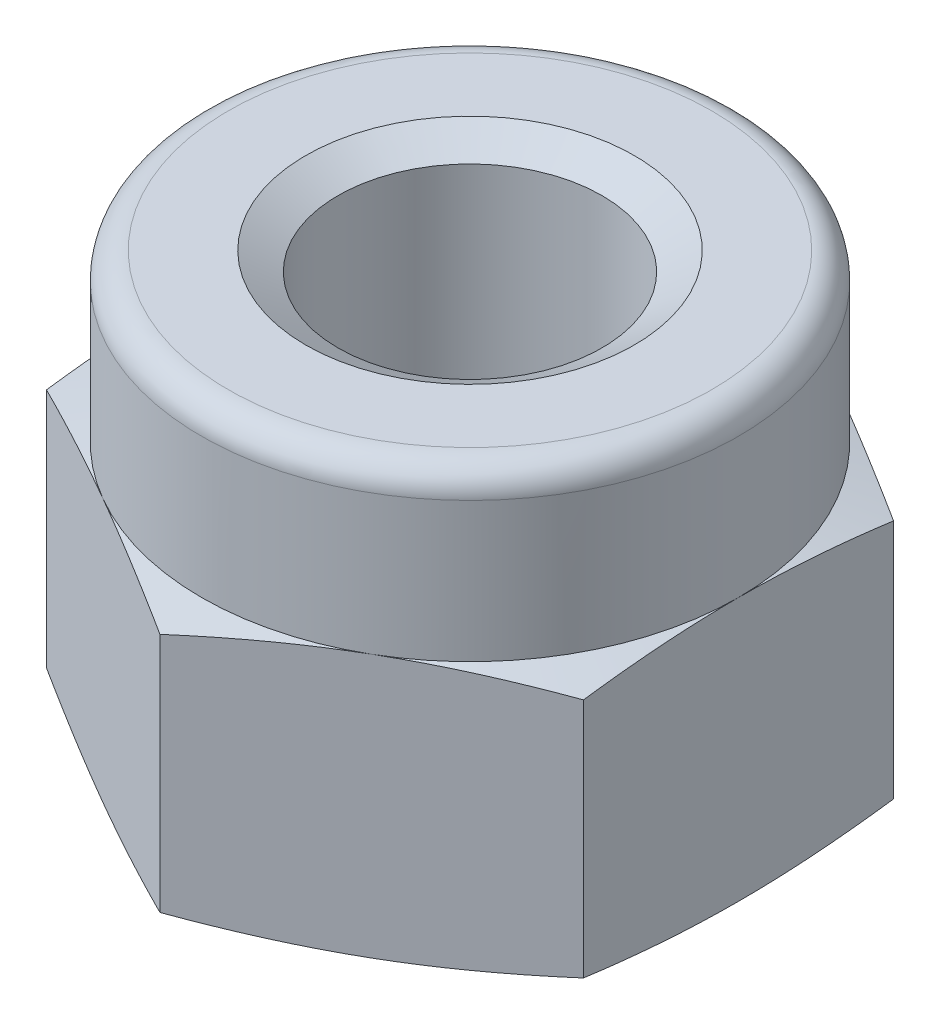
ISO-10303-21;
HEADER;
FILE_DESCRIPTION(('STEP AP214'),'2;1');
FILE_NAME('part.step','',(''),(''),'','','');
FILE_SCHEMA(('AUTOMOTIVE_DESIGN { 1 0 10303 214 1 1 1 1 }'));
ENDSEC;
DATA;
#1=APPLICATION_CONTEXT('core data for automotive mechanical design processes');
#2=APPLICATION_PROTOCOL_DEFINITION('international standard','automotive_design',2000,#1);
#3=PRODUCT_CONTEXT('',#1,'mechanical');
#4=PRODUCT('Part','Part','',(#3));
#5=PRODUCT_RELATED_PRODUCT_CATEGORY('part','',(#4));
#6=PRODUCT_DEFINITION_FORMATION('','',#4);
#7=PRODUCT_DEFINITION_CONTEXT('part definition',#1,'design');
#8=PRODUCT_DEFINITION('design','',#6,#7);
#9=PRODUCT_DEFINITION_SHAPE('','',#8);
#10=(LENGTH_UNIT() NAMED_UNIT(*) SI_UNIT(.MILLI.,.METRE.));
#11=(NAMED_UNIT(*) PLANE_ANGLE_UNIT() SI_UNIT($,.RADIAN.));
#12=(NAMED_UNIT(*) SI_UNIT($,.STERADIAN.) SOLID_ANGLE_UNIT());
#13=UNCERTAINTY_MEASURE_WITH_UNIT(LENGTH_MEASURE(1.E-05),#10,'distance_accuracy_value','');
#14=(GEOMETRIC_REPRESENTATION_CONTEXT(3) GLOBAL_UNCERTAINTY_ASSIGNED_CONTEXT((#13)) GLOBAL_UNIT_ASSIGNED_CONTEXT((#10,
#11,#12)) REPRESENTATION_CONTEXT('',''));
#15=CARTESIAN_POINT('',(0.,0.,0.));
#16=DIRECTION('',(0.,0.,1.));
#17=DIRECTION('',(1.,0.,0.));
#18=AXIS2_PLACEMENT_3D('',#15,#16,#17);
#19=CARTESIAN_POINT('',(5.00000000000105,-2.45,-2.88675134594868));
#20=DIRECTION('',(-1.,0.,-3.6340990143452E-13));
#21=DIRECTION('',(-3.6340990143452E-13,0.,1.));
#22=AXIS2_PLACEMENT_3D('',#19,#20,#21);
#23=PLANE('',#22);
#24=CARTESIAN_POINT('',(4.99999999999685,1.10934459288645,8.66417297932728));
#25=CARTESIAN_POINT('',(4.99999999999693,1.15808614967386,8.45412169108949));
#26=CARTESIAN_POINT('',(4.99999999999701,1.20641968231584,8.2439749367323));
#27=CARTESIAN_POINT('',(4.99999999999716,1.30208749492634,7.82345057278734));
#28=CARTESIAN_POINT('',(4.99999999999724,1.34942175824772,7.61307295941494));
#29=CARTESIAN_POINT('',(4.99999999999739,1.44291588680185,7.19201028723198));
#30=CARTESIAN_POINT('',(4.99999999999747,1.48907550643841,6.98132517370842));
#31=CARTESIAN_POINT('',(4.99999999999762,1.57996348211581,6.55964793700647));
#32=CARTESIAN_POINT('',(4.99999999999769,1.62469184297197,6.34865581486346));
#33=CARTESIAN_POINT('',(4.99999999999793,1.75712266829011,5.71122740580277));
#34=CARTESIAN_POINT('',(4.99999999999808,1.84219487473616,5.28423568193629));
#35=CARTESIAN_POINT('',(4.99999999999839,2.00199924023723,4.42825912558533));
#36=CARTESIAN_POINT('',(4.99999999999855,2.0767305268644,3.99927412808701));
#37=CARTESIAN_POINT('',(4.99999999999886,2.2088694770559,3.15035991830124));
#38=CARTESIAN_POINT('',(4.99999999999901,2.26668904574731,2.73049749789896));
#39=CARTESIAN_POINT('',(4.99999999999924,2.33763793791692,2.09896734425149));
#40=CARTESIAN_POINT('',(4.99999999999932,2.35865631824952,1.88818678859669));
#41=CARTESIAN_POINT('',(4.99999999999947,2.39462146723631,1.46611392864948));
#42=CARTESIAN_POINT('',(4.99999999999954,2.40956865320926,1.25482166053561));
#43=CARTESIAN_POINT('',(4.9999999999997,2.43266726095044,0.832771506173624));
#44=CARTESIAN_POINT('',(4.99999999999978,2.44084761509829,0.622015226370882));
#45=CARTESIAN_POINT('',(4.99999999999993,2.4501072703111,0.200344833296584));
#46=CARTESIAN_POINT('',(5.00000000000001,2.45118659959506,-0.0105692793444221));
#47=CARTESIAN_POINT('',(5.00000000000016,2.44618667142744,-0.432327799392837));
#48=CARTESIAN_POINT('',(5.00000000000024,2.4401068634497,-0.643172200192301));
#49=CARTESIAN_POINT('',(5.00000000000039,2.42110292737698,-1.06454502542287));
#50=CARTESIAN_POINT('',(5.00000000000046,2.40817881293568,-1.27507345048348));
#51=CARTESIAN_POINT('',(5.00000000000065,2.3692469157974,-1.78526753626905));
#52=CARTESIAN_POINT('',(5.00000000000076,2.34001060854997,-2.0846867910644));
#53=CARTESIAN_POINT('',(5.00000000000098,2.27111774430938,-2.68227635693411));
#54=CARTESIAN_POINT('',(5.00000000000108,2.23146161252042,-2.98044671846803));
#55=CARTESIAN_POINT('',(5.0000000000013,2.14389497710899,-3.57650881311258));
#56=CARTESIAN_POINT('',(5.00000000000141,2.0959590232753,-3.8743967522919));
#57=CARTESIAN_POINT('',(5.00000000000162,1.99387348312166,-4.4690916535893));
#58=CARTESIAN_POINT('',(5.00000000000173,1.93972392757731,-4.76589862105388));
#59=CARTESIAN_POINT('',(5.00000000000195,1.8255759229453,-5.36466752407298));
#60=CARTESIAN_POINT('',(5.00000000000206,1.76548055597248,-5.66661084262669));
#61=CARTESIAN_POINT('',(5.00000000000228,1.64159901952771,-6.26973849767605));
#62=CARTESIAN_POINT('',(5.00000000000239,1.57781280993869,-6.57092282588481));
#63=CARTESIAN_POINT('',(5.00000000000261,1.44778554471525,-7.17106884648911));
#64=CARTESIAN_POINT('',(5.00000000000272,1.38155947444426,-7.47003380096172));
#65=CARTESIAN_POINT('',(5.00000000000293,1.24693398621573,-8.06745283586174));
#66=CARTESIAN_POINT('',(5.00000000000304,1.1785347200478,-8.36590695044156));
#67=CARTESIAN_POINT('',(5.00000000000315,1.10934459288535,-8.66417297932839));
#68=B_SPLINE_CURVE_WITH_KNOTS('',3,(#24,#25,#26,#27,#28,#29,#30,#31,#32,#33,#34,#35,#36,#37,#38,
#39,#40,#41,#42,#43,#44,#45,#46,#47,#48,#49,#50,#51,#52,#53,#54,#55,#56,#57,#58,#59,#60,#61,#62,
#63,#64,#65,#66,#67),.UNSPECIFIED.,.F.,.F.,(4,2,2,2,2,2,2,2,2,2,2,2,2,2,2,2,2,2,2,2,2,4),(0.,
0.646897511041875,1.29380579046934,1.94084823323586,2.58788849886854,3.89394954484933,
5.20012071161692,6.47115823307902,7.10656342538024,7.74192493411692,8.37455563035548,
9.00718381255952,9.63986064603122,10.2725362173825,11.1748227850967,12.0770725387094,
12.9821466196792,13.887216218064,14.810782909334,15.7343596410585,16.6529875210141,
17.5715513786974),.UNSPECIFIED.);
#69=CARTESIAN_POINT('',(4.99999999999895,2.24274057836342,2.88675134594756));
#70=VERTEX_POINT('',#69);
#71=CARTESIAN_POINT('',(5.,2.45,0.));
#72=VERTEX_POINT('',#71);
#73=EDGE_CURVE('E174',#70,#72,#68,.T.);
#74=ORIENTED_EDGE('',*,*,#73,.F.);
#75=DIRECTION('',(0.,1.,0.));
#76=VECTOR('',#75,1.);
#77=CARTESIAN_POINT('',(4.99999999999895,-2.45,2.88675134594756));
#78=LINE('',#77,#76);
#79=CARTESIAN_POINT('',(5.00000000000305,-2.24274057836278,2.8867513459452));
#80=VERTEX_POINT('',#79);
#81=EDGE_CURVE('E345',#80,#70,#78,.T.);
#82=ORIENTED_EDGE('',*,*,#81,.F.);
#83=CARTESIAN_POINT('',(5.00000000000315,-1.10934459288535,-8.66417297932839));
#84=CARTESIAN_POINT('',(5.00000000000307,-1.15808614967279,-8.45412169109052));
#85=CARTESIAN_POINT('',(5.000000000003,-1.20641968231479,-8.24397493673324));
#86=CARTESIAN_POINT('',(5.00000000000284,-1.30208749492535,-7.82345057278811));
#87=CARTESIAN_POINT('',(5.00000000000277,-1.34942175824675,-7.61307295941563));
#88=CARTESIAN_POINT('',(5.00000000000261,-1.44291588680093,-7.1920102872325));
#89=CARTESIAN_POINT('',(5.00000000000254,-1.48907550643752,-6.98132517370886));
#90=CARTESIAN_POINT('',(5.00000000000239,-1.57996348211498,-6.55964793700674));
#91=CARTESIAN_POINT('',(5.00000000000231,-1.62469184297117,-6.34865581486365));
#92=CARTESIAN_POINT('',(5.00000000000208,-1.75712266828939,-5.71122740580269));
#93=CARTESIAN_POINT('',(5.00000000000192,-1.8421948747355,-5.28423568193604));
#94=CARTESIAN_POINT('',(5.00000000000161,-2.00199924023669,-4.42825912558472));
#95=CARTESIAN_POINT('',(5.00000000000145,-2.07673052686392,-3.99927412808623));
#96=CARTESIAN_POINT('',(5.00000000000115,-2.20886947705554,-3.15035991830012));
#97=CARTESIAN_POINT('',(5.00000000000099,-2.26668904574701,-2.73049749789768));
#98=CARTESIAN_POINT('',(5.00000000000076,-2.3376379379167,-2.09896734424996));
#99=CARTESIAN_POINT('',(5.00000000000069,-2.35865631824933,-1.88818678859507));
#100=CARTESIAN_POINT('',(5.00000000000053,-2.39462146723617,-1.4661139286477));
#101=CARTESIAN_POINT('',(5.00000000000046,-2.40956865320915,-1.25482166053375));
#102=CARTESIAN_POINT('',(5.0000000000003,-2.43266726095037,-0.832771506171595));
#103=CARTESIAN_POINT('',(5.00000000000023,-2.44084761509824,-0.62201522636877));
#104=CARTESIAN_POINT('',(5.00000000000007,-2.45010727031109,-0.200344833294306));
#105=CARTESIAN_POINT('',(5.,-2.45118659959506,0.0105692793467844));
#106=CARTESIAN_POINT('',(4.99999999999984,-2.44618667142746,0.432327799395367));
#107=CARTESIAN_POINT('',(4.99999999999977,-2.44010686344974,0.643172200194915));
#108=CARTESIAN_POINT('',(4.99999999999961,-2.42110292737703,1.06454502542566));
#109=CARTESIAN_POINT('',(4.99999999999954,-2.40817881293573,1.27507345048635));
#110=CARTESIAN_POINT('',(4.99999999999935,-2.36924691579747,1.78526753627182));
#111=CARTESIAN_POINT('',(4.99999999999924,-2.34001060855007,2.08468679106701));
#112=CARTESIAN_POINT('',(4.99999999999903,-2.27111774430955,2.68227635693638));
#113=CARTESIAN_POINT('',(4.99999999999892,-2.23146161252063,2.98044671847014));
#114=CARTESIAN_POINT('',(4.9999999999987,-2.14389497710927,3.57650881311436));
#115=CARTESIAN_POINT('',(4.99999999999859,-2.09595902327563,3.8743967522935));
#116=CARTESIAN_POINT('',(4.99999999999838,-1.99387348312208,4.46909165359058));
#117=CARTESIAN_POINT('',(4.99999999999827,-1.93972392757777,4.76589862105498));
#118=CARTESIAN_POINT('',(4.99999999999805,-1.82557592294586,5.36466752407375));
#119=CARTESIAN_POINT('',(4.99999999999794,-1.76548055597309,5.66661084262729));
#120=CARTESIAN_POINT('',(4.99999999999772,-1.64159901952842,6.2697384976763));
#121=CARTESIAN_POINT('',(4.99999999999761,-1.57781280993945,6.5709228258849));
#122=CARTESIAN_POINT('',(4.9999999999974,-1.4477855447161,7.17106884648885));
#123=CARTESIAN_POINT('',(4.99999999999729,-1.38155947444516,7.47003380096129));
#124=CARTESIAN_POINT('',(4.99999999999707,-1.24693398621674,8.06745283586097));
#125=CARTESIAN_POINT('',(4.99999999999696,-1.17853472004885,8.36590695044062));
#126=CARTESIAN_POINT('',(4.99999999999685,-1.10934459288645,8.66417297932728));
#127=B_SPLINE_CURVE_WITH_KNOTS('',3,(#83,#84,#85,#86,#87,#88,#89,#90,#91,#92,#93,#94,#95,#96,
#97,#98,#99,#100,#101,#102,#103,#104,#105,#106,#107,#108,#109,#110,#111,#112,#113,#114,#115,
#116,#117,#118,#119,#120,#121,#122,#123,#124,#125,#126),.UNSPECIFIED.,.F.,.F.,(4,2,2,2,2,2,2,2,
2,2,2,2,2,2,2,2,2,2,2,2,2,4),(0.,0.64689751104214,1.29380579046987,1.94084823323665,
2.5878884988696,3.89394954485094,5.20012071161908,6.47115823308169,7.10656342538316,
7.7419249341201,8.37455563035891,9.0071838125632,9.63986064603515,10.2725362173867,
11.1748227851003,12.0770725387126,12.9821466196819,13.8872162180661,14.8107829093356,
15.7343596410595,16.6529875210146,17.5715513786974),.UNSPECIFIED.);
#128=CARTESIAN_POINT('',(5.,-2.45,1.81590693388966E-12));
#129=VERTEX_POINT('',#128);
#130=EDGE_CURVE('E918',#129,#80,#127,.T.);
#131=ORIENTED_EDGE('',*,*,#130,.F.);
#132=CARTESIAN_POINT('',(5.00000000000105,-2.24274057836278,-2.88675134594868));
#133=VERTEX_POINT('',#132);
#134=EDGE_CURVE('E919',#133,#129,#127,.T.);
#135=ORIENTED_EDGE('',*,*,#134,.F.);
#136=DIRECTION('',(0.,1.,0.));
#137=VECTOR('',#136,1.);
#138=CARTESIAN_POINT('',(5.00000000000105,-2.45,-2.88675134594868));
#139=LINE('',#138,#137);
#140=CARTESIAN_POINT('',(5.00000000000103,2.24274057836278,-2.88675134594869));
#141=VERTEX_POINT('',#140);
#142=EDGE_CURVE('E921',#133,#141,#139,.T.);
#143=ORIENTED_EDGE('',*,*,#142,.T.);
#144=EDGE_CURVE('E139',#72,#141,#68,.T.);
#145=ORIENTED_EDGE('',*,*,#144,.F.);
#146=EDGE_LOOP('',(#74,#82,#131,#135,#143,#145));
#147=FACE_BOUND('',#146,.T.);
#148=ADVANCED_FACE('F18',(#147),#23,.F.);
#149=CARTESIAN_POINT('',(4.99999999999895,-2.45,2.88675134594756));
#150=DIRECTION('',(-0.500000000000305,0.,-0.866025403784263));
#151=DIRECTION('',(-0.866025403784263,0.,0.500000000000305));
#152=AXIS2_PLACEMENT_3D('',#149,#150,#151);
#153=PLANE('',#152);
#154=CARTESIAN_POINT('',(-0.000200000000000168,2.24270963732693,5.77361816195127));
#155=CARTESIAN_POINT('',(0.207454004305619,2.2748479038167,5.65372906666702));
#156=CARTESIAN_POINT('',(0.415484518325616,2.30402418697629,5.53362259339782));
#157=CARTESIAN_POINT('',(0.832280248969635,2.35528422981972,5.29298546611322));
#158=CARTESIAN_POINT('',(1.04104572932951,2.37736510843063,5.17245465982984));
#159=CARTESIAN_POINT('',(1.45804559853937,2.41314523215366,4.9316996730893));
#160=CARTESIAN_POINT('',(1.66627716741271,2.42688714813309,4.8114771207464));
#161=CARTESIAN_POINT('',(2.08300586365663,2.44531365579599,4.57087869579073));
#162=CARTESIAN_POINT('',(2.29150293182804,2.44999999999997,4.45050285735662));
#163=CARTESIAN_POINT('',(2.70849706817087,2.45000000000003,4.2097511804884));
#164=CARTESIAN_POINT('',(2.91699413634228,2.44531365579611,4.08937534205429));
#165=CARTESIAN_POINT('',(3.3337228325862,2.42688714813334,3.84877691709862));
#166=CARTESIAN_POINT('',(3.54195440145955,2.41314523215396,3.72855436475572));
#167=CARTESIAN_POINT('',(3.95895427066942,2.37736510843104,3.48779937801517));
#168=CARTESIAN_POINT('',(4.1677197510293,2.35528422982018,3.36726857173179));
#169=CARTESIAN_POINT('',(4.58451548167332,2.30402418697684,3.12663144444718));
#170=CARTESIAN_POINT('',(4.79254599569333,2.27484790381729,3.00652497117798));
#171=CARTESIAN_POINT('',(5.00019999999895,2.24270963732755,2.88663587589373));
#172=B_SPLINE_CURVE_WITH_KNOTS('',3,(#154,#155,#156,#157,#158,#159,#160,#161,#162,#163,#164,
#165,#166,#167,#168,#169,#170,#171),.UNSPECIFIED.,.F.,.F.,(4,2,2,2,2,2,2,2,4),(0.,
0.725805237679802,1.4519048156153,2.1742568688339,2.89646911159514,3.61868135435637,
4.34103340757497,5.06713298551048,5.79293822319028),.UNSPECIFIED.);
#173=CARTESIAN_POINT('',(0.,2.24274057836278,5.77350269189743));
#174=VERTEX_POINT('',#173);
#175=CARTESIAN_POINT('',(2.50000000000153,2.45,4.33012701892132));
#176=VERTEX_POINT('',#175);
#177=EDGE_CURVE('E238',#174,#176,#172,.T.);
#178=ORIENTED_EDGE('',*,*,#177,.F.);
#179=DIRECTION('',(0.,1.,0.));
#180=VECTOR('',#179,1.);
#181=CARTESIAN_POINT('',(0.,-2.45,5.77350269189743));
#182=LINE('',#181,#180);
#183=CARTESIAN_POINT('',(0.,-2.24274057836278,5.77350269189743));
#184=VERTEX_POINT('',#183);
#185=EDGE_CURVE('E341',#184,#174,#182,.T.);
#186=ORIENTED_EDGE('',*,*,#185,.F.);
#187=CARTESIAN_POINT('',(5.00019999999895,-2.24270963732755,2.88663587589373));
#188=CARTESIAN_POINT('',(4.79254599569333,-2.27484790381729,3.00652497117798));
#189=CARTESIAN_POINT('',(4.58451548167332,-2.30402418697684,3.12663144444718));
#190=CARTESIAN_POINT('',(4.1677197510293,-2.35528422982018,3.36726857173179));
#191=CARTESIAN_POINT('',(3.95895427066942,-2.37736510843104,3.48779937801517));
#192=CARTESIAN_POINT('',(3.54195440145955,-2.41314523215395,3.72855436475572));
#193=CARTESIAN_POINT('',(3.3337228325862,-2.42688714813333,3.84877691709862));
#194=CARTESIAN_POINT('',(2.91699413634228,-2.44531365579611,4.08937534205429));
#195=CARTESIAN_POINT('',(2.70849706817087,-2.45000000000003,4.2097511804884));
#196=CARTESIAN_POINT('',(2.29150293182804,-2.44999999999997,4.45050285735662));
#197=CARTESIAN_POINT('',(2.08300586365663,-2.44531365579599,4.57087869579073));
#198=CARTESIAN_POINT('',(1.66627716741271,-2.42688714813309,4.8114771207464));
#199=CARTESIAN_POINT('',(1.45804559853937,-2.41314523215365,4.9316996730893));
#200=CARTESIAN_POINT('',(1.04104572932951,-2.37736510843063,5.17245465982984));
#201=CARTESIAN_POINT('',(0.832280248969634,-2.35528422981972,5.29298546611322));
#202=CARTESIAN_POINT('',(0.415484518325616,-2.30402418697629,5.53362259339782));
#203=CARTESIAN_POINT('',(0.207454004305619,-2.2748479038167,5.65372906666702));
#204=CARTESIAN_POINT('',(-0.00020000000000088,-2.24270963732693,5.77361816195127));
#205=B_SPLINE_CURVE_WITH_KNOTS('',3,(#187,#188,#189,#190,#191,#192,#193,#194,#195,#196,#197,
#198,#199,#200,#201,#202,#203,#204),.UNSPECIFIED.,.F.,.F.,(4,2,2,2,2,2,2,2,4),(0.,
0.725805237679804,1.45190481561531,2.17425686883391,2.89646911159515,3.61868135435638,
4.34103340757498,5.06713298551048,5.79293822319028),.UNSPECIFIED.);
#206=CARTESIAN_POINT('',(2.50000000000153,-2.45,4.33012701892132));
#207=VERTEX_POINT('',#206);
#208=EDGE_CURVE('E373',#207,#184,#205,.T.);
#209=ORIENTED_EDGE('',*,*,#208,.F.);
#210=EDGE_CURVE('E917',#80,#207,#205,.T.);
#211=ORIENTED_EDGE('',*,*,#210,.F.);
#212=ORIENTED_EDGE('',*,*,#81,.T.);
#213=EDGE_CURVE('E43',#176,#70,#172,.T.);
#214=ORIENTED_EDGE('',*,*,#213,.F.);
#215=EDGE_LOOP('',(#178,#186,#209,#211,#212,#214));
#216=FACE_BOUND('',#215,.T.);
#217=ADVANCED_FACE('F297',(#216),#153,.F.);
#218=CARTESIAN_POINT('',(0.,-2.45,5.77350269189743));
#219=DIRECTION('',(0.500000000000309,0.,-0.86602540378426));
#220=DIRECTION('',(-0.86602540378426,0.,-0.500000000000309));
#221=AXIS2_PLACEMENT_3D('',#218,#219,#220);
#222=PLANE('',#221);
#223=CARTESIAN_POINT('',(-5.000199999999,2.24270963732755,2.88663587589366));
#224=CARTESIAN_POINT('',(-4.79254599569337,2.27484790381729,3.00652497117792));
#225=CARTESIAN_POINT('',(-4.58451548167337,2.30402418697684,3.12663144444712));
#226=CARTESIAN_POINT('',(-4.16771975102934,2.35528422982018,3.36726857173174));
#227=CARTESIAN_POINT('',(-3.95895427066946,2.37736510843104,3.48779937801512));
#228=CARTESIAN_POINT('',(-3.54195440145958,2.41314523215396,3.72855436475567));
#229=CARTESIAN_POINT('',(-3.33372283258623,2.42688714813334,3.84877691709858));
#230=CARTESIAN_POINT('',(-2.91699413634231,2.44531365579612,4.08937534205425));
#231=CARTESIAN_POINT('',(-2.70849706817089,2.45000000000004,4.20975118048836));
#232=CARTESIAN_POINT('',(-2.29150293182806,2.44999999999997,4.45050285735659));
#233=CARTESIAN_POINT('',(-2.08300586365665,2.445313655796,4.5708786957907));
#234=CARTESIAN_POINT('',(-1.66627716741273,2.4268871481331,4.81147712074637));
#235=CARTESIAN_POINT('',(-1.45804559853938,2.41314523215366,4.93169967308928));
#236=CARTESIAN_POINT('',(-1.04104572932952,2.37736510843064,5.17245465982983));
#237=CARTESIAN_POINT('',(-0.832280248969641,2.35528422981972,5.2929854661132));
#238=CARTESIAN_POINT('',(-0.41548451832562,2.30402418697629,5.53362259339781));
#239=CARTESIAN_POINT('',(-0.207454004305621,2.2748479038167,5.65372906666702));
#240=CARTESIAN_POINT('',(0.000199999999998921,2.24270963732693,5.77361816195127));
#241=B_SPLINE_CURVE_WITH_KNOTS('',3,(#223,#224,#225,#226,#227,#228,#229,#230,#231,#232,#233,
#234,#235,#236,#237,#238,#239,#240),.UNSPECIFIED.,.F.,.F.,(4,2,2,2,2,2,2,2,4),(0.,
0.725805237679813,1.45190481561533,2.17425686883394,2.89646911159518,3.61868135435643,
4.34103340757503,5.06713298551055,5.79293822319036),.UNSPECIFIED.);
#242=CARTESIAN_POINT('',(-4.999999999999,2.24274057836278,2.88675134595221));
#243=VERTEX_POINT('',#242);
#244=CARTESIAN_POINT('',(-2.50000000000155,2.45,4.3301270189213));
#245=VERTEX_POINT('',#244);
#246=EDGE_CURVE('E250',#243,#245,#241,.T.);
#247=ORIENTED_EDGE('',*,*,#246,.F.);
#248=DIRECTION('',(0.,1.,0.));
#249=VECTOR('',#248,1.);
#250=CARTESIAN_POINT('',(-4.999999999999,-2.45,2.8867513459475));
#251=LINE('',#250,#249);
#252=CARTESIAN_POINT('',(-4.999999999999,-2.24274057836278,2.88675134595221));
#253=VERTEX_POINT('',#252);
#254=EDGE_CURVE('E335',#253,#243,#251,.T.);
#255=ORIENTED_EDGE('',*,*,#254,.F.);
#256=CARTESIAN_POINT('',(0.0002,-2.24270963732693,5.77361816195127));
#257=CARTESIAN_POINT('',(-0.20745400430562,-2.2748479038167,5.65372906666702));
#258=CARTESIAN_POINT('',(-0.415484518325619,-2.30402418697629,5.53362259339781));
#259=CARTESIAN_POINT('',(-0.832280248969641,-2.35528422981972,5.2929854661132));
#260=CARTESIAN_POINT('',(-1.04104572932952,-2.37736510843064,5.17245465982983));
#261=CARTESIAN_POINT('',(-1.45804559853938,-2.41314523215366,4.93169967308928));
#262=CARTESIAN_POINT('',(-1.66627716741273,-2.4268871481331,4.81147712074637));
#263=CARTESIAN_POINT('',(-2.08300586365665,-2.44531365579599,4.5708786957907));
#264=CARTESIAN_POINT('',(-2.29150293182806,-2.44999999999997,4.45050285735659));
#265=CARTESIAN_POINT('',(-2.70849706817089,-2.45000000000003,4.20975118048836));
#266=CARTESIAN_POINT('',(-2.91699413634231,-2.44531365579612,4.08937534205425));
#267=CARTESIAN_POINT('',(-3.33372283258623,-2.42688714813334,3.84877691709858));
#268=CARTESIAN_POINT('',(-3.54195440145958,-2.41314523215396,3.72855436475567));
#269=CARTESIAN_POINT('',(-3.95895427066946,-2.37736510843104,3.48779937801512));
#270=CARTESIAN_POINT('',(-4.16771975102934,-2.35528422982018,3.36726857173174));
#271=CARTESIAN_POINT('',(-4.58451548167337,-2.30402418697684,3.12663144444712));
#272=CARTESIAN_POINT('',(-4.79254599569337,-2.27484790381729,3.00652497117792));
#273=CARTESIAN_POINT('',(-5.000199999999,-2.24270963732755,2.88663587589366));
#274=B_SPLINE_CURVE_WITH_KNOTS('',3,(#256,#257,#258,#259,#260,#261,#262,#263,#264,#265,#266,
#267,#268,#269,#270,#271,#272,#273),.UNSPECIFIED.,.F.,.F.,(4,2,2,2,2,2,2,2,4),(0.,
0.725805237679811,1.45190481561532,2.17425686883393,2.89646911159517,3.61868135435642,
4.34103340757503,5.06713298551054,5.79293822319036),.UNSPECIFIED.);
#275=CARTESIAN_POINT('',(-2.50000000000155,-2.45,4.3301270189213));
#276=VERTEX_POINT('',#275);
#277=EDGE_CURVE('E368',#276,#253,#274,.T.);
#278=ORIENTED_EDGE('',*,*,#277,.F.);
#279=EDGE_CURVE('E370',#184,#276,#274,.T.);
#280=ORIENTED_EDGE('',*,*,#279,.F.);
#281=ORIENTED_EDGE('',*,*,#185,.T.);
#282=EDGE_CURVE('E252',#245,#174,#241,.T.);
#283=ORIENTED_EDGE('',*,*,#282,.F.);
#284=EDGE_LOOP('',(#247,#255,#278,#280,#281,#283));
#285=FACE_BOUND('',#284,.T.);
#286=ADVANCED_FACE('F304',(#285),#222,.F.);
#287=CARTESIAN_POINT('',(-4.999999999999,-2.45,2.8867513459475));
#288=DIRECTION('',(1.,0.,-3.48687218366894E-13));
#289=DIRECTION('',(-3.48687218366894E-13,0.,-1.));
#290=AXIS2_PLACEMENT_3D('',#287,#288,#289);
#291=PLANE('',#290);
#292=CARTESIAN_POINT('',(-5.00000000000303,1.10934459288534,-8.66417297932849));
#293=CARTESIAN_POINT('',(-5.00000000000295,1.15808614967278,-8.45412169109061));
#294=CARTESIAN_POINT('',(-5.00000000000288,1.20641968231479,-8.24397493673334));
#295=CARTESIAN_POINT('',(-5.00000000000273,1.30208749492534,-7.82345057278821));
#296=CARTESIAN_POINT('',(-5.00000000000266,1.34942175824674,-7.61307295941573));
#297=CARTESIAN_POINT('',(-5.00000000000251,1.44291588680093,-7.1920102872326));
#298=CARTESIAN_POINT('',(-5.00000000000244,1.48907550643752,-6.98132517370896));
#299=CARTESIAN_POINT('',(-5.00000000000229,1.57996348211498,-6.55964793700683));
#300=CARTESIAN_POINT('',(-5.00000000000222,1.62469184297116,-6.34865581486374));
#301=CARTESIAN_POINT('',(-5.000000000002,1.75712266828939,-5.71122740580278));
#302=CARTESIAN_POINT('',(-5.00000000000185,1.84219487473549,-5.28423568193613));
#303=CARTESIAN_POINT('',(-5.00000000000155,2.00199924023669,-4.42825912558481));
#304=CARTESIAN_POINT('',(-5.0000000000014,2.07673052686392,-3.99927412808632));
#305=CARTESIAN_POINT('',(-5.0000000000011,2.20886947705554,-3.15035991830021));
#306=CARTESIAN_POINT('',(-5.00000000000096,2.26668904574701,-2.73049749789777));
#307=CARTESIAN_POINT('',(-5.00000000000074,2.33763793791669,-2.09896734425005));
#308=CARTESIAN_POINT('',(-5.00000000000067,2.35865631824933,-1.88818678859516));
#309=CARTESIAN_POINT('',(-5.00000000000052,2.39462146723617,-1.46611392864778));
#310=CARTESIAN_POINT('',(-5.00000000000044,2.40956865320915,-1.25482166053383));
#311=CARTESIAN_POINT('',(-5.0000000000003,2.43266726095036,-0.832771506171675));
#312=CARTESIAN_POINT('',(-5.00000000000022,2.44084761509824,-0.62201522636885));
#313=CARTESIAN_POINT('',(-5.00000000000008,2.45010727031108,-0.200344833294385));
#314=CARTESIAN_POINT('',(-5.,2.45118659959506,0.0105692793467063));
#315=CARTESIAN_POINT('',(-4.99999999999986,2.44618667142746,0.432327799395291));
#316=CARTESIAN_POINT('',(-4.99999999999978,2.44010686344973,0.643172200194839));
#317=CARTESIAN_POINT('',(-4.99999999999964,2.42110292737703,1.06454502542558));
#318=CARTESIAN_POINT('',(-4.99999999999956,2.40817881293573,1.27507345048627));
#319=CARTESIAN_POINT('',(-4.99999999999939,2.36924691579747,1.78526753627175));
#320=CARTESIAN_POINT('',(-4.99999999999928,2.34001060855007,2.08468679106694));
#321=CARTESIAN_POINT('',(-4.99999999999907,2.27111774430955,2.68227635693632));
#322=CARTESIAN_POINT('',(-4.99999999999897,2.23146161252063,2.98044671847007));
#323=CARTESIAN_POINT('',(-4.99999999999876,2.14389497710927,3.57650881311429));
#324=CARTESIAN_POINT('',(-4.99999999999866,2.09595902327563,3.87439675229344));
#325=CARTESIAN_POINT('',(-4.99999999999845,1.99387348312208,4.46909165359051));
#326=CARTESIAN_POINT('',(-4.99999999999834,1.93972392757777,4.76589862105492));
#327=CARTESIAN_POINT('',(-4.99999999999814,1.82557592294585,5.36466752407369));
#328=CARTESIAN_POINT('',(-4.99999999999803,1.76548055597309,5.66661084262724));
#329=CARTESIAN_POINT('',(-4.99999999999782,1.64159901952841,6.26973849767625));
#330=CARTESIAN_POINT('',(-4.99999999999772,1.57781280993944,6.57092282588485));
#331=CARTESIAN_POINT('',(-4.99999999999751,1.4477855447161,7.1710688464888));
#332=CARTESIAN_POINT('',(-4.9999999999974,1.38155947444515,7.47003380096125));
#333=CARTESIAN_POINT('',(-4.99999999999719,1.24693398621673,8.06745283586093));
#334=CARTESIAN_POINT('',(-4.99999999999709,1.17853472004885,8.36590695044058));
#335=CARTESIAN_POINT('',(-4.99999999999698,1.10934459288644,8.66417297932724));
#336=B_SPLINE_CURVE_WITH_KNOTS('',3,(#292,#293,#294,#295,#296,#297,#298,#299,#300,#301,#302,
#303,#304,#305,#306,#307,#308,#309,#310,#311,#312,#313,#314,#315,#316,#317,#318,#319,#320,#321,
#322,#323,#324,#325,#326,#327,#328,#329,#330,#331,#332,#333,#334,#335),.UNSPECIFIED.,.F.,.F.,(4,
2,2,2,2,2,2,2,2,2,2,2,2,2,2,2,2,2,2,2,2,4),(0.,0.646897511042141,1.29380579046987,
1.94084823323665,2.5878884988696,3.89394954485095,5.20012071161909,6.4711582330817,
7.10656342538318,7.74192493412012,8.37455563035894,9.00718381256323,9.63986064603518,
10.2725362173867,11.1748227851004,12.0770725387126,12.9821466196819,13.8872162180662,
14.8107829093356,15.7343596410596,16.6529875210147,17.5715513786975),.UNSPECIFIED.);
#337=CARTESIAN_POINT('',(-5.00000000000098,2.24274057836278,-2.88675134594877));
#338=VERTEX_POINT('',#337);
#339=CARTESIAN_POINT('',(-5.,2.45,1.74230620911177E-12));
#340=VERTEX_POINT('',#339);
#341=EDGE_CURVE('E260',#338,#340,#336,.T.);
#342=ORIENTED_EDGE('',*,*,#341,.F.);
#343=DIRECTION('',(0.,1.,0.));
#344=VECTOR('',#343,1.);
#345=CARTESIAN_POINT('',(-5.00000000000101,-2.45,-2.88675134594876));
#346=LINE('',#345,#344);
#347=CARTESIAN_POINT('',(-5.00000000000098,-2.24274057836278,-2.88675134594877));
#348=VERTEX_POINT('',#347);
#349=EDGE_CURVE('E342',#348,#338,#346,.T.);
#350=ORIENTED_EDGE('',*,*,#349,.F.);
#351=CARTESIAN_POINT('',(-4.99999999999698,-1.10934459288644,8.66417297932724));
#352=CARTESIAN_POINT('',(-4.99999999999706,-1.15808614967385,8.45412169108945));
#353=CARTESIAN_POINT('',(-4.99999999999713,-1.20641968231583,8.24397493673226));
#354=CARTESIAN_POINT('',(-4.99999999999728,-1.30208749492634,7.8234505727873));
#355=CARTESIAN_POINT('',(-4.99999999999735,-1.34942175824771,7.6130729594149));
#356=CARTESIAN_POINT('',(-4.9999999999975,-1.44291588680184,7.19201028723194));
#357=CARTESIAN_POINT('',(-4.99999999999757,-1.4890755064384,6.98132517370838));
#358=CARTESIAN_POINT('',(-4.99999999999772,-1.5799634821158,6.55964793700642));
#359=CARTESIAN_POINT('',(-4.99999999999779,-1.62469184297197,6.34865581486342));
#360=CARTESIAN_POINT('',(-4.99999999999801,-1.7571226682901,5.71122740580272));
#361=CARTESIAN_POINT('',(-4.99999999999816,-1.84219487473615,5.28423568193624));
#362=CARTESIAN_POINT('',(-4.99999999999846,-2.00199924023722,4.42825912558527));
#363=CARTESIAN_POINT('',(-4.99999999999861,-2.07673052686439,3.99927412808696));
#364=CARTESIAN_POINT('',(-4.99999999999891,-2.20886947705589,3.15035991830118));
#365=CARTESIAN_POINT('',(-4.99999999999905,-2.26668904574731,2.73049749789891));
#366=CARTESIAN_POINT('',(-4.99999999999928,-2.33763793791691,2.09896734425144));
#367=CARTESIAN_POINT('',(-4.99999999999935,-2.35865631824952,1.88818678859663));
#368=CARTESIAN_POINT('',(-4.9999999999995,-2.39462146723631,1.46611392864942));
#369=CARTESIAN_POINT('',(-4.99999999999957,-2.40956865320926,1.25482166053555));
#370=CARTESIAN_POINT('',(-4.99999999999972,-2.43266726095043,0.832771506173561));
#371=CARTESIAN_POINT('',(-4.99999999999979,-2.44084761509829,0.622015226370818));
#372=CARTESIAN_POINT('',(-4.99999999999994,-2.4501072703111,0.200344833296519));
#373=CARTESIAN_POINT('',(-5.00000000000001,-2.45118659959506,-0.010569279344488));
#374=CARTESIAN_POINT('',(-5.00000000000016,-2.44618667142743,-0.432327799392905));
#375=CARTESIAN_POINT('',(-5.00000000000023,-2.4401068634497,-0.64317220019237));
#376=CARTESIAN_POINT('',(-5.00000000000038,-2.42110292737698,-1.06454502542294));
#377=CARTESIAN_POINT('',(-5.00000000000045,-2.40817881293568,-1.27507345048355));
#378=CARTESIAN_POINT('',(-5.00000000000062,-2.36924691579739,-1.78526753626912));
#379=CARTESIAN_POINT('',(-5.00000000000073,-2.34001060854997,-2.08468679106448));
#380=CARTESIAN_POINT('',(-5.00000000000094,-2.27111774430938,-2.68227635693419));
#381=CARTESIAN_POINT('',(-5.00000000000105,-2.23146161252042,-2.98044671846811));
#382=CARTESIAN_POINT('',(-5.00000000000125,-2.14389497710898,-3.57650881311266));
#383=CARTESIAN_POINT('',(-5.00000000000136,-2.0959590232753,-3.87439675229197));
#384=CARTESIAN_POINT('',(-5.00000000000157,-1.99387348312166,-4.46909165358938));
#385=CARTESIAN_POINT('',(-5.00000000000167,-1.9397239275773,-4.76589862105396));
#386=CARTESIAN_POINT('',(-5.00000000000188,-1.82557592294529,-5.36466752407306));
#387=CARTESIAN_POINT('',(-5.00000000000198,-1.76548055597248,-5.66661084262678));
#388=CARTESIAN_POINT('',(-5.00000000000219,-1.6415990195277,-6.26973849767614));
#389=CARTESIAN_POINT('',(-5.0000000000023,-1.57781280993869,-6.5709228258849));
#390=CARTESIAN_POINT('',(-5.00000000000251,-1.44778554471524,-7.1710688464892));
#391=CARTESIAN_POINT('',(-5.00000000000261,-1.38155947444425,-7.47003380096182));
#392=CARTESIAN_POINT('',(-5.00000000000282,-1.24693398621573,-8.06745283586184));
#393=CARTESIAN_POINT('',(-5.00000000000292,-1.17853472004779,-8.36590695044165));
#394=CARTESIAN_POINT('',(-5.00000000000303,-1.10934459288534,-8.66417297932849));
#395=B_SPLINE_CURVE_WITH_KNOTS('',3,(#351,#352,#353,#354,#355,#356,#357,#358,#359,#360,#361,
#362,#363,#364,#365,#366,#367,#368,#369,#370,#371,#372,#373,#374,#375,#376,#377,#378,#379,#380,
#381,#382,#383,#384,#385,#386,#387,#388,#389,#390,#391,#392,#393,#394),.UNSPECIFIED.,.F.,.F.,(4,
2,2,2,2,2,2,2,2,2,2,2,2,2,2,2,2,2,2,2,2,4),(0.,0.646897511041876,1.29380579046935,
1.94084823323586,2.58788849886855,3.89394954484934,5.20012071161694,6.47115823307904,
7.10656342538026,7.74192493411694,8.37455563035551,9.00718381255955,9.63986064603125,
10.2725362173826,11.1748227850967,12.0770725387095,12.9821466196793,13.8872162180641,
14.810782909334,15.7343596410585,16.6529875210141,17.5715513786975),.UNSPECIFIED.);
#396=CARTESIAN_POINT('',(-5.,-2.45,1.74229351855154E-12));
#397=VERTEX_POINT('',#396);
#398=EDGE_CURVE('E376',#397,#348,#395,.T.);
#399=ORIENTED_EDGE('',*,*,#398,.F.);
#400=EDGE_CURVE('E338',#253,#397,#395,.T.);
#401=ORIENTED_EDGE('',*,*,#400,.F.);
#402=ORIENTED_EDGE('',*,*,#254,.T.);
#403=EDGE_CURVE('E240',#340,#243,#336,.T.);
#404=ORIENTED_EDGE('',*,*,#403,.F.);
#405=EDGE_LOOP('',(#342,#350,#399,#401,#402,#404));
#406=FACE_BOUND('',#405,.T.);
#407=ADVANCED_FACE('F319',(#406),#291,.F.);
#408=CARTESIAN_POINT('',(-5.00000000000101,-2.45,-2.88675134594876));
#409=DIRECTION('',(0.499999999999685,0.,0.866025403784621));
#410=DIRECTION('',(0.866025403784621,0.,-0.499999999999685));
#411=AXIS2_PLACEMENT_3D('',#408,#409,#410);
#412=PLANE('',#411);
#413=CARTESIAN_POINT('',(0.000200000000035802,2.24270963732755,-5.7736181619489));
#414=CARTESIAN_POINT('',(-0.207454004305676,2.27484790381729,-5.6537290666648));
#415=CARTESIAN_POINT('',(-0.415484518325766,2.30402418697684,-5.53362259339574));
#416=CARTESIAN_POINT('',(-0.832280248969968,2.35528422982018,-5.29298546611143));
#417=CARTESIAN_POINT('',(-1.04104572932993,2.37736510843104,-5.1724546598282));
#418=CARTESIAN_POINT('',(-1.45804559853998,2.41314523215396,-4.93169967308795));
#419=CARTESIAN_POINT('',(-1.66627716741341,2.42688714813334,-4.81147712074519));
#420=CARTESIAN_POINT('',(-2.08300586365751,2.44531365579612,-4.57087869578982));
#421=CARTESIAN_POINT('',(-2.29150293182901,2.45000000000003,-4.45050285735586));
#422=CARTESIAN_POINT('',(-2.70849706817201,2.44999999999997,-4.20975118048794));
#423=CARTESIAN_POINT('',(-2.91699413634351,2.44531365579599,-4.08937534205397));
#424=CARTESIAN_POINT('',(-3.3337228325876,2.42688714813309,-3.84877691709861));
#425=CARTESIAN_POINT('',(-3.54195440146103,2.41314523215365,-3.72855436475586));
#426=CARTESIAN_POINT('',(-3.95895427067107,2.37736510843063,-3.48779937801561));
#427=CARTESIAN_POINT('',(-4.16771975103103,2.35528422981971,-3.36726857173238));
#428=CARTESIAN_POINT('',(-4.58451548167522,2.30402418697628,-3.12663144444807));
#429=CARTESIAN_POINT('',(-4.7925459956953,2.27484790381669,-3.00652497117902));
#430=CARTESIAN_POINT('',(-5.00020000000101,2.24270963732692,-2.88663587589492));
#431=B_SPLINE_CURVE_WITH_KNOTS('',3,(#413,#414,#415,#416,#417,#418,#419,#420,#421,#422,#423,
#424,#425,#426,#427,#428,#429,#430),.UNSPECIFIED.,.F.,.F.,(4,2,2,2,2,2,2,2,4),(0.,
0.725805237679808,1.45190481561532,2.17425686883392,2.89646911159516,3.6186813543564,
4.341033407575,5.06713298551051,5.79293822319032),.UNSPECIFIED.);
#432=CARTESIAN_POINT('',(-4.06272238073769E-12,2.24274057836278,-5.77350269189743));
#433=VERTEX_POINT('',#432);
#434=CARTESIAN_POINT('',(-2.49999999999842,2.45,-4.33012701892311));
#435=VERTEX_POINT('',#434);
#436=EDGE_CURVE('E140',#433,#435,#431,.T.);
#437=ORIENTED_EDGE('',*,*,#436,.F.);
#438=DIRECTION('',(0.,1.,0.));
#439=VECTOR('',#438,1.);
#440=CARTESIAN_POINT('',(0.,-2.45,-5.77350269189507));
#441=LINE('',#440,#439);
#442=CARTESIAN_POINT('',(-4.06272238073769E-12,-2.24274057836278,-5.77350269189743));
#443=VERTEX_POINT('',#442);
#444=EDGE_CURVE('E131',#443,#433,#441,.T.);
#445=ORIENTED_EDGE('',*,*,#444,.F.);
#446=CARTESIAN_POINT('',(-5.00020000000101,-2.24270963732692,-2.88663587589492));
#447=CARTESIAN_POINT('',(-4.7925459956953,-2.27484790381669,-3.00652497117902));
#448=CARTESIAN_POINT('',(-4.58451548167522,-2.30402418697628,-3.12663144444807));
#449=CARTESIAN_POINT('',(-4.16771975103103,-2.35528422981971,-3.36726857173238));
#450=CARTESIAN_POINT('',(-3.95895427067107,-2.37736510843063,-3.48779937801561));
#451=CARTESIAN_POINT('',(-3.54195440146103,-2.41314523215365,-3.72855436475586));
#452=CARTESIAN_POINT('',(-3.3337228325876,-2.42688714813309,-3.84877691709861));
#453=CARTESIAN_POINT('',(-2.91699413634351,-2.44531365579599,-4.08937534205398));
#454=CARTESIAN_POINT('',(-2.70849706817201,-2.44999999999997,-4.20975118048794));
#455=CARTESIAN_POINT('',(-2.29150293182901,-2.45000000000003,-4.45050285735586));
#456=CARTESIAN_POINT('',(-2.08300586365751,-2.44531365579611,-4.57087869578982));
#457=CARTESIAN_POINT('',(-1.66627716741341,-2.42688714813334,-4.81147712074519));
#458=CARTESIAN_POINT('',(-1.45804559853998,-2.41314523215396,-4.93169967308795));
#459=CARTESIAN_POINT('',(-1.04104572932993,-2.37736510843104,-5.1724546598282));
#460=CARTESIAN_POINT('',(-0.832280248969968,-2.35528422982018,-5.29298546611143));
#461=CARTESIAN_POINT('',(-0.415484518325765,-2.30402418697684,-5.53362259339574));
#462=CARTESIAN_POINT('',(-0.207454004305675,-2.27484790381729,-5.6537290666648));
#463=CARTESIAN_POINT('',(0.000200000000036708,-2.24270963732755,-5.7736181619489));
#464=B_SPLINE_CURVE_WITH_KNOTS('',3,(#446,#447,#448,#449,#450,#451,#452,#453,#454,#455,#456,
#457,#458,#459,#460,#461,#462,#463),.UNSPECIFIED.,.F.,.F.,(4,2,2,2,2,2,2,2,4),(0.,
0.725805237679805,1.45190481561531,2.17425686883392,2.89646911159515,3.61868135435639,
4.341033407575,5.06713298551051,5.79293822319032),.UNSPECIFIED.);
#465=CARTESIAN_POINT('',(-2.49999999999842,-2.45,-4.3301270189231));
#466=VERTEX_POINT('',#465);
#467=EDGE_CURVE('E410',#466,#443,#464,.T.);
#468=ORIENTED_EDGE('',*,*,#467,.F.);
#469=EDGE_CURVE('E417',#348,#466,#464,.T.);
#470=ORIENTED_EDGE('',*,*,#469,.F.);
#471=ORIENTED_EDGE('',*,*,#349,.T.);
#472=EDGE_CURVE('E177',#435,#338,#431,.T.);
#473=ORIENTED_EDGE('',*,*,#472,.F.);
#474=EDGE_LOOP('',(#437,#445,#468,#470,#471,#473));
#475=FACE_BOUND('',#474,.T.);
#476=ADVANCED_FACE('F308',(#475),#412,.F.);
#477=CARTESIAN_POINT('',(0.,-2.45,-5.77350269189507));
#478=DIRECTION('',(-0.499999999999697,0.,0.866025403784614));
#479=DIRECTION('',(0.866025403784614,0.,0.499999999999697));
#480=AXIS2_PLACEMENT_3D('',#477,#478,#479);
#481=PLANE('',#480);
#482=CARTESIAN_POINT('',(5.00020000000105,2.24270963732692,-2.88663587589484));
#483=CARTESIAN_POINT('',(4.79254599569535,2.27484790381669,-3.00652497117895));
#484=CARTESIAN_POINT('',(4.58451548167526,2.30402418697628,-3.12663144444801));
#485=CARTESIAN_POINT('',(4.16771975103108,2.35528422981971,-3.36726857173232));
#486=CARTESIAN_POINT('',(3.95895427067112,2.37736510843063,-3.48779937801555));
#487=CARTESIAN_POINT('',(3.54195440146108,2.41314523215365,-3.72855436475581));
#488=CARTESIAN_POINT('',(3.33372283258765,2.42688714813309,-3.84877691709856));
#489=CARTESIAN_POINT('',(2.91699413634357,2.44531365579599,-4.08937534205393));
#490=CARTESIAN_POINT('',(2.70849706817207,2.44999999999997,-4.2097511804879));
#491=CARTESIAN_POINT('',(2.29150293182907,2.45000000000003,-4.45050285735583));
#492=CARTESIAN_POINT('',(2.08300586365757,2.44531365579612,-4.5708786957898));
#493=CARTESIAN_POINT('',(1.66627716741348,2.42688714813334,-4.81147712074517));
#494=CARTESIAN_POINT('',(1.45804559854004,2.41314523215396,-4.93169967308793));
#495=CARTESIAN_POINT('',(1.04104572933,2.37736510843104,-5.17245465982819));
#496=CARTESIAN_POINT('',(0.832280248970037,2.35528422982018,-5.29298546611142));
#497=CARTESIAN_POINT('',(0.415484518325836,2.30402418697684,-5.53362259339574));
#498=CARTESIAN_POINT('',(0.207454004305747,2.27484790381729,-5.65372906666479));
#499=CARTESIAN_POINT('',(-0.00019999999996431,2.24270963732756,-5.7736181619489));
#500=B_SPLINE_CURVE_WITH_KNOTS('',3,(#482,#483,#484,#485,#486,#487,#488,#489,#490,#491,#492,
#493,#494,#495,#496,#497,#498,#499),.UNSPECIFIED.,.F.,.F.,(4,2,2,2,2,2,2,2,4),(0.,
0.725805237679808,1.45190481561531,2.17425686883392,2.89646911159516,3.6186813543564,
4.34103340757501,5.06713298551052,5.79293822319033),.UNSPECIFIED.);
#501=CARTESIAN_POINT('',(2.49999999999849,2.45,-4.33012701892307));
#502=VERTEX_POINT('',#501);
#503=EDGE_CURVE('E127',#141,#502,#500,.T.);
#504=ORIENTED_EDGE('',*,*,#503,.F.);
#505=ORIENTED_EDGE('',*,*,#142,.F.);
#506=CARTESIAN_POINT('',(-0.000199999999964407,-2.24270963732756,-5.7736181619489));
#507=CARTESIAN_POINT('',(0.207454004305747,-2.27484790381729,-5.65372906666479));
#508=CARTESIAN_POINT('',(0.415484518325836,-2.30402418697684,-5.53362259339574));
#509=CARTESIAN_POINT('',(0.832280248970037,-2.35528422982018,-5.29298546611142));
#510=CARTESIAN_POINT('',(1.04104572933,-2.37736510843104,-5.17245465982819));
#511=CARTESIAN_POINT('',(1.45804559854004,-2.41314523215396,-4.93169967308793));
#512=CARTESIAN_POINT('',(1.66627716741348,-2.42688714813334,-4.81147712074517));
#513=CARTESIAN_POINT('',(2.08300586365757,-2.44531365579611,-4.5708786957898));
#514=CARTESIAN_POINT('',(2.29150293182907,-2.45000000000003,-4.45050285735583));
#515=CARTESIAN_POINT('',(2.70849706817207,-2.44999999999997,-4.2097511804879));
#516=CARTESIAN_POINT('',(2.91699413634357,-2.44531365579599,-4.08937534205393));
#517=CARTESIAN_POINT('',(3.33372283258765,-2.42688714813309,-3.84877691709856));
#518=CARTESIAN_POINT('',(3.54195440146108,-2.41314523215365,-3.72855436475581));
#519=CARTESIAN_POINT('',(3.95895427067112,-2.37736510843063,-3.48779937801555));
#520=CARTESIAN_POINT('',(4.16771975103108,-2.35528422981971,-3.36726857173232));
#521=CARTESIAN_POINT('',(4.58451548167526,-2.30402418697628,-3.12663144444801));
#522=CARTESIAN_POINT('',(4.79254599569535,-2.27484790381669,-3.00652497117895));
#523=CARTESIAN_POINT('',(5.00020000000105,-2.24270963732692,-2.88663587589484));
#524=B_SPLINE_CURVE_WITH_KNOTS('',3,(#506,#507,#508,#509,#510,#511,#512,#513,#514,#515,#516,
#517,#518,#519,#520,#521,#522,#523),.UNSPECIFIED.,.F.,.F.,(4,2,2,2,2,2,2,2,4),(0.,
0.72580523767981,1.45190481561532,2.17425686883393,2.89646911159517,3.61868135435641,
4.34103340757501,5.06713298551052,5.79293822319032),.UNSPECIFIED.);
#525=CARTESIAN_POINT('',(2.49999999999849,-2.45,-4.33012701892307));
#526=VERTEX_POINT('',#525);
#527=EDGE_CURVE('E251',#526,#133,#524,.T.);
#528=ORIENTED_EDGE('',*,*,#527,.F.);
#529=EDGE_CURVE('E418',#443,#526,#524,.T.);
#530=ORIENTED_EDGE('',*,*,#529,.F.);
#531=ORIENTED_EDGE('',*,*,#444,.T.);
#532=EDGE_CURVE('E124',#502,#433,#500,.T.);
#533=ORIENTED_EDGE('',*,*,#532,.F.);
#534=EDGE_LOOP('',(#504,#505,#528,#530,#531,#533));
#535=FACE_BOUND('',#534,.T.);
#536=ADVANCED_FACE('F125',(#535),#481,.F.);
#537=CARTESIAN_POINT('',(0.,-2.45,0.));
#538=DIRECTION('',(0.,1.,0.));
#539=DIRECTION('',(-1.,0.,0.));
#540=AXIS2_PLACEMENT_3D('',#537,#538,#539);
#541=CONICAL_SURFACE('',#540,5.,1.30899693899575);
#542=ORIENTED_EDGE('',*,*,#134,.T.);
#543=CARTESIAN_POINT('',(0.,-2.45,0.));
#544=DIRECTION('',(0.,-1.,0.));
#545=DIRECTION('',(0.,0.,-1.));
#546=AXIS2_PLACEMENT_3D('',#543,#544,#545);
#547=CIRCLE('',#546,5.);
#548=EDGE_CURVE('E359',#526,#129,#547,.T.);
#549=ORIENTED_EDGE('',*,*,#548,.F.);
#550=ORIENTED_EDGE('',*,*,#527,.T.);
#551=EDGE_LOOP('',(#542,#549,#550));
#552=FACE_BOUND('',#551,.T.);
#553=ADVANCED_FACE('F310',(#552),#541,.T.);
#554=ORIENTED_EDGE('',*,*,#130,.T.);
#555=ORIENTED_EDGE('',*,*,#210,.T.);
#556=EDGE_CURVE('E146',#129,#207,#547,.T.);
#557=ORIENTED_EDGE('',*,*,#556,.F.);
#558=EDGE_LOOP('',(#554,#555,#557));
#559=FACE_BOUND('',#558,.T.);
#560=ADVANCED_FACE('F315',(#559),#541,.T.);
#561=ORIENTED_EDGE('',*,*,#279,.T.);
#562=EDGE_CURVE('E153',#207,#276,#547,.T.);
#563=ORIENTED_EDGE('',*,*,#562,.F.);
#564=ORIENTED_EDGE('',*,*,#208,.T.);
#565=EDGE_LOOP('',(#561,#563,#564));
#566=FACE_BOUND('',#565,.T.);
#567=ADVANCED_FACE('F371',(#566),#541,.T.);
#568=ORIENTED_EDGE('',*,*,#277,.T.);
#569=ORIENTED_EDGE('',*,*,#400,.T.);
#570=EDGE_CURVE('E357',#276,#397,#547,.T.);
#571=ORIENTED_EDGE('',*,*,#570,.F.);
#572=EDGE_LOOP('',(#568,#569,#571));
#573=FACE_BOUND('',#572,.T.);
#574=ADVANCED_FACE('F367',(#573),#541,.T.);
#575=ORIENTED_EDGE('',*,*,#398,.T.);
#576=ORIENTED_EDGE('',*,*,#469,.T.);
#577=EDGE_CURVE('E353',#397,#466,#547,.T.);
#578=ORIENTED_EDGE('',*,*,#577,.F.);
#579=EDGE_LOOP('',(#575,#576,#578));
#580=FACE_BOUND('',#579,.T.);
#581=ADVANCED_FACE('F493',(#580),#541,.T.);
#582=ORIENTED_EDGE('',*,*,#467,.T.);
#583=ORIENTED_EDGE('',*,*,#529,.T.);
#584=EDGE_CURVE('E155',#466,#526,#547,.T.);
#585=ORIENTED_EDGE('',*,*,#584,.F.);
#586=EDGE_LOOP('',(#582,#583,#585));
#587=FACE_BOUND('',#586,.T.);
#588=ADVANCED_FACE('F318',(#587),#541,.T.);
#589=CARTESIAN_POINT('',(0.,-2.45,0.));
#590=DIRECTION('',(0.,-1.,0.));
#591=DIRECTION('',(0.,0.,-1.));
#592=AXIS2_PLACEMENT_3D('',#589,#590,#591);
#593=PLANE('',#592);
#594=CARTESIAN_POINT('',(0.,-2.45,0.));
#595=DIRECTION('',(0.,1.,0.));
#596=DIRECTION('',(0.,0.,1.));
#597=AXIS2_PLACEMENT_3D('',#594,#595,#596);
#598=CIRCLE('',#597,3.0585);
#599=CARTESIAN_POINT('',(0.,-2.45,3.0585));
#600=VERTEX_POINT('',#599);
#601=EDGE_CURVE('E263',#600,#600,#598,.T.);
#602=ORIENTED_EDGE('',*,*,#601,.T.);
#603=EDGE_LOOP('',(#602));
#604=FACE_BOUND('',#603,.T.);
#605=ORIENTED_EDGE('',*,*,#548,.T.);
#606=ORIENTED_EDGE('',*,*,#556,.T.);
#607=ORIENTED_EDGE('',*,*,#562,.T.);
#608=ORIENTED_EDGE('',*,*,#570,.T.);
#609=ORIENTED_EDGE('',*,*,#577,.T.);
#610=ORIENTED_EDGE('',*,*,#584,.T.);
#611=EDGE_LOOP('',(#605,#606,#607,#608,#609,#610));
#612=FACE_BOUND('',#611,.T.);
#613=ADVANCED_FACE('F361',(#604,#612),#593,.T.);
#614=CARTESIAN_POINT('',(0.,2.24274057836278,0.));
#615=DIRECTION('',(0.,-1.,0.));
#616=DIRECTION('',(1.,0.,0.));
#617=AXIS2_PLACEMENT_3D('',#614,#615,#616);
#618=CONICAL_SURFACE('',#617,5.77350269189743,1.30899693899575);
#619=ORIENTED_EDGE('',*,*,#213,.T.);
#620=ORIENTED_EDGE('',*,*,#73,.T.);
#621=CARTESIAN_POINT('',(0.,2.45,0.));
#622=DIRECTION('',(0.,-1.,0.));
#623=DIRECTION('',(0.,0.,-1.));
#624=AXIS2_PLACEMENT_3D('',#621,#622,#623);
#625=CIRCLE('',#624,5.);
#626=EDGE_CURVE('E115',#72,#176,#625,.T.);
#627=ORIENTED_EDGE('',*,*,#626,.T.);
#628=EDGE_LOOP('',(#619,#620,#627));
#629=FACE_BOUND('',#628,.T.);
#630=ADVANCED_FACE('F425',(#629),#618,.T.);
#631=ORIENTED_EDGE('',*,*,#144,.T.);
#632=ORIENTED_EDGE('',*,*,#503,.T.);
#633=CARTESIAN_POINT('',(0.,2.45,0.));
#634=DIRECTION('',(0.,-1.,0.));
#635=DIRECTION('',(0.,0.,-1.));
#636=AXIS2_PLACEMENT_3D('',#633,#634,#635);
#637=CIRCLE('',#636,5.);
#638=EDGE_CURVE('E109',#502,#72,#637,.T.);
#639=ORIENTED_EDGE('',*,*,#638,.T.);
#640=EDGE_LOOP('',(#631,#632,#639));
#641=FACE_BOUND('',#640,.T.);
#642=ADVANCED_FACE('F137',(#641),#618,.T.);
#643=ORIENTED_EDGE('',*,*,#177,.T.);
#644=EDGE_CURVE('E119',#176,#245,#625,.T.);
#645=ORIENTED_EDGE('',*,*,#644,.T.);
#646=ORIENTED_EDGE('',*,*,#282,.T.);
#647=EDGE_LOOP('',(#643,#645,#646));
#648=FACE_BOUND('',#647,.T.);
#649=ADVANCED_FACE('F531',(#648),#618,.T.);
#650=ORIENTED_EDGE('',*,*,#246,.T.);
#651=EDGE_CURVE('E35',#245,#340,#637,.T.);
#652=ORIENTED_EDGE('',*,*,#651,.T.);
#653=ORIENTED_EDGE('',*,*,#403,.T.);
#654=EDGE_LOOP('',(#650,#652,#653));
#655=FACE_BOUND('',#654,.T.);
#656=ADVANCED_FACE('F207',(#655),#618,.T.);
#657=ORIENTED_EDGE('',*,*,#341,.T.);
#658=EDGE_CURVE('E145',#340,#435,#637,.T.);
#659=ORIENTED_EDGE('',*,*,#658,.T.);
#660=ORIENTED_EDGE('',*,*,#472,.T.);
#661=EDGE_LOOP('',(#657,#659,#660));
#662=FACE_BOUND('',#661,.T.);
#663=ADVANCED_FACE('F206',(#662),#618,.T.);
#664=ORIENTED_EDGE('',*,*,#436,.T.);
#665=EDGE_CURVE('E113',#435,#502,#637,.T.);
#666=ORIENTED_EDGE('',*,*,#665,.T.);
#667=ORIENTED_EDGE('',*,*,#532,.T.);
#668=EDGE_LOOP('',(#664,#666,#667));
#669=FACE_BOUND('',#668,.T.);
#670=ADVANCED_FACE('F142',(#669),#618,.T.);
#671=CARTESIAN_POINT('',(0.,5.55,0.));
#672=DIRECTION('',(0.,-1.,0.));
#673=DIRECTION('',(0.,0.,-1.));
#674=AXIS2_PLACEMENT_3D('',#671,#672,#673);
#675=CYLINDRICAL_SURFACE('',#674,5.);
#676=CARTESIAN_POINT('',(0.,5.05,0.));
#677=DIRECTION('',(0.,-1.,0.));
#678=DIRECTION('',(0.,0.,-1.));
#679=AXIS2_PLACEMENT_3D('',#676,#677,#678);
#680=CIRCLE('',#679,5.);
#681=CARTESIAN_POINT('',(0.,5.05,-5.));
#682=VERTEX_POINT('',#681);
#683=EDGE_CURVE('E27',#682,#682,#680,.T.);
#684=ORIENTED_EDGE('',*,*,#683,.T.);
#685=EDGE_LOOP('',(#684));
#686=FACE_BOUND('',#685,.T.);
#687=ORIENTED_EDGE('',*,*,#638,.F.);
#688=ORIENTED_EDGE('',*,*,#665,.F.);
#689=ORIENTED_EDGE('',*,*,#658,.F.);
#690=ORIENTED_EDGE('',*,*,#651,.F.);
#691=ORIENTED_EDGE('',*,*,#644,.F.);
#692=ORIENTED_EDGE('',*,*,#626,.F.);
#693=EDGE_LOOP('',(#687,#688,#689,#690,#691,#692));
#694=FACE_BOUND('',#693,.T.);
#695=ADVANCED_FACE('F111',(#686,#694),#675,.T.);
#696=CARTESIAN_POINT('',(0.,5.55,0.));
#697=DIRECTION('',(0.,-1.,0.));
#698=DIRECTION('',(0.,0.,-1.));
#699=AXIS2_PLACEMENT_3D('',#696,#697,#698);
#700=PLANE('',#699);
#701=CARTESIAN_POINT('',(0.,5.55,0.));
#702=DIRECTION('',(0.,-1.,0.));
#703=DIRECTION('',(0.,0.,1.));
#704=AXIS2_PLACEMENT_3D('',#701,#702,#703);
#705=CIRCLE('',#704,3.0585);
#706=CARTESIAN_POINT('',(0.,5.55,3.0585));
#707=VERTEX_POINT('',#706);
#708=EDGE_CURVE('E270',#707,#707,#705,.T.);
#709=ORIENTED_EDGE('',*,*,#708,.T.);
#710=EDGE_LOOP('',(#709));
#711=FACE_BOUND('',#710,.T.);
#712=CARTESIAN_POINT('',(0.,5.55,0.));
#713=DIRECTION('',(0.,-1.,0.));
#714=DIRECTION('',(0.,0.,-1.));
#715=AXIS2_PLACEMENT_3D('',#712,#713,#714);
#716=CIRCLE('',#715,4.5);
#717=CARTESIAN_POINT('',(0.,5.55,-4.5));
#718=VERTEX_POINT('',#717);
#719=EDGE_CURVE('E11',#718,#718,#716,.F.);
#720=ORIENTED_EDGE('',*,*,#719,.T.);
#721=EDGE_LOOP('',(#720));
#722=FACE_BOUND('',#721,.T.);
#723=ADVANCED_FACE('F275',(#711,#722),#700,.F.);
#724=CARTESIAN_POINT('',(0.,5.05,0.));
#725=DIRECTION('',(0.,-1.,0.));
#726=DIRECTION('',(0.,0.,-1.));
#727=AXIS2_PLACEMENT_3D('',#724,#725,#726);
#728=TOROIDAL_SURFACE('',#727,4.5,0.5);
#729=ORIENTED_EDGE('',*,*,#719,.F.);
#730=EDGE_LOOP('',(#729));
#731=FACE_BOUND('',#730,.T.);
#732=ORIENTED_EDGE('',*,*,#683,.F.);
#733=EDGE_LOOP('',(#732));
#734=FACE_BOUND('',#733,.T.);
#735=ADVANCED_FACE('F20',(#731,#734),#728,.T.);
#736=CARTESIAN_POINT('',(0.,14.7991909386042,0.));
#737=DIRECTION('',(0.,-1.,0.));
#738=DIRECTION('',(0.,0.,-1.));
#739=AXIS2_PLACEMENT_3D('',#736,#737,#738);
#740=CYLINDRICAL_SURFACE('',#739,2.4585);
#741=CARTESIAN_POINT('',(0.,5.20358983848622,0.));
#742=DIRECTION('',(0.,1.,0.));
#743=DIRECTION('',(0.,0.,1.));
#744=AXIS2_PLACEMENT_3D('',#741,#742,#743);
#745=CIRCLE('',#744,2.4585);
#746=CARTESIAN_POINT('',(0.,5.20358983848622,2.4585));
#747=VERTEX_POINT('',#746);
#748=EDGE_CURVE('E22',#747,#747,#745,.T.);
#749=ORIENTED_EDGE('',*,*,#748,.T.);
#750=EDGE_LOOP('',(#749));
#751=FACE_BOUND('',#750,.T.);
#752=CARTESIAN_POINT('',(0.,-2.10358983848623,0.));
#753=DIRECTION('',(0.,-1.,0.));
#754=DIRECTION('',(0.,0.,-1.));
#755=AXIS2_PLACEMENT_3D('',#752,#753,#754);
#756=CIRCLE('',#755,2.4585);
#757=CARTESIAN_POINT('',(0.,-2.10358983848623,-2.4585));
#758=VERTEX_POINT('',#757);
#759=EDGE_CURVE('E135',#758,#758,#756,.T.);
#760=ORIENTED_EDGE('',*,*,#759,.T.);
#761=EDGE_LOOP('',(#760));
#762=FACE_BOUND('',#761,.T.);
#763=ADVANCED_FACE('F285',(#751,#762),#740,.F.);
#764=CARTESIAN_POINT('',(0.,-2.45,0.));
#765=DIRECTION('',(0.,-1.,0.));
#766=DIRECTION('',(0.,0.,1.));
#767=AXIS2_PLACEMENT_3D('',#764,#765,#766);
#768=CONICAL_SURFACE('',#767,3.0585,1.0471975511966);
#769=ORIENTED_EDGE('',*,*,#601,.F.);
#770=EDGE_LOOP('',(#769));
#771=FACE_BOUND('',#770,.T.);
#772=ORIENTED_EDGE('',*,*,#759,.F.);
#773=EDGE_LOOP('',(#772));
#774=FACE_BOUND('',#773,.T.);
#775=ADVANCED_FACE('F281',(#771,#774),#768,.F.);
#776=CARTESIAN_POINT('',(0.,5.55,0.));
#777=DIRECTION('',(0.,1.,0.));
#778=DIRECTION('',(0.,0.,1.));
#779=AXIS2_PLACEMENT_3D('',#776,#777,#778);
#780=CONICAL_SURFACE('',#779,3.0585,1.0471975511966);
#781=ORIENTED_EDGE('',*,*,#708,.F.);
#782=EDGE_LOOP('',(#781));
#783=FACE_BOUND('',#782,.T.);
#784=ORIENTED_EDGE('',*,*,#748,.F.);
#785=EDGE_LOOP('',(#784));
#786=FACE_BOUND('',#785,.T.);
#787=ADVANCED_FACE('F278',(#783,#786),#780,.F.);
#788=CLOSED_SHELL('',(#148,#217,#286,#407,#476,#536,#553,#560,#567,#574,#581,#588,#613,#630,
#642,#649,#656,#663,#670,#695,#723,#735,#763,#775,#787));
#789=MANIFOLD_SOLID_BREP('B1',#788);
#790=ADVANCED_BREP_SHAPE_REPRESENTATION('',(#18,#789),#14);
#791=SHAPE_DEFINITION_REPRESENTATION(#9,#790);
ENDSEC;
END-ISO-10303-21;
